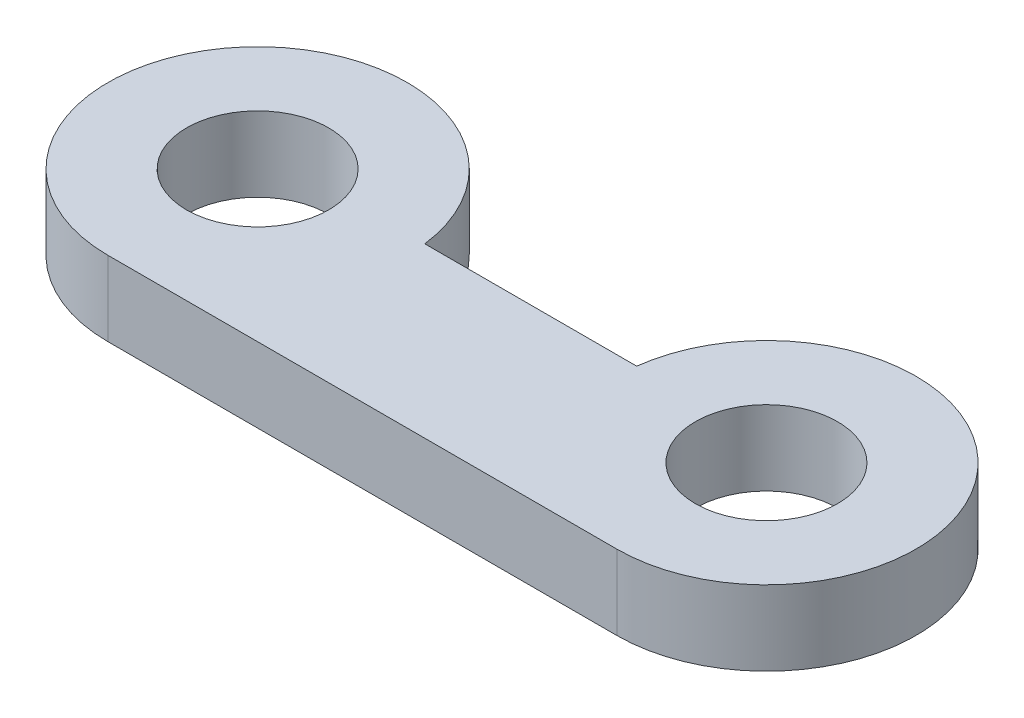
ISO-10303-21;
HEADER;
FILE_DESCRIPTION(('STEP AP214'),'2;1');
FILE_NAME('part.step','',(''),(''),'','','');
FILE_SCHEMA(('AUTOMOTIVE_DESIGN { 1 0 10303 214 1 1 1 1 }'));
ENDSEC;
DATA;
#1=APPLICATION_CONTEXT('core data for automotive mechanical design processes');
#2=APPLICATION_PROTOCOL_DEFINITION('international standard','automotive_design',2000,#1);
#3=PRODUCT_CONTEXT('',#1,'mechanical');
#4=PRODUCT('Part','Part','',(#3));
#5=PRODUCT_RELATED_PRODUCT_CATEGORY('part','',(#4));
#6=PRODUCT_DEFINITION_FORMATION('','',#4);
#7=PRODUCT_DEFINITION_CONTEXT('part definition',#1,'design');
#8=PRODUCT_DEFINITION('design','',#6,#7);
#9=PRODUCT_DEFINITION_SHAPE('','',#8);
#10=(LENGTH_UNIT() NAMED_UNIT(*) SI_UNIT(.MILLI.,.METRE.));
#11=(NAMED_UNIT(*) PLANE_ANGLE_UNIT() SI_UNIT($,.RADIAN.));
#12=(NAMED_UNIT(*) SI_UNIT($,.STERADIAN.) SOLID_ANGLE_UNIT());
#13=UNCERTAINTY_MEASURE_WITH_UNIT(LENGTH_MEASURE(1.E-05),#10,'distance_accuracy_value','');
#14=(GEOMETRIC_REPRESENTATION_CONTEXT(3) GLOBAL_UNCERTAINTY_ASSIGNED_CONTEXT((#13)) GLOBAL_UNIT_ASSIGNED_CONTEXT((#10,
#11,#12)) REPRESENTATION_CONTEXT('',''));
#15=CARTESIAN_POINT('',(0.,0.,0.));
#16=DIRECTION('',(0.,0.,1.));
#17=DIRECTION('',(1.,0.,0.));
#18=AXIS2_PLACEMENT_3D('',#15,#16,#17);
#19=CARTESIAN_POINT('',(-6.8,2.,-4.));
#20=DIRECTION('',(0.,-1.,0.));
#21=DIRECTION('',(0.,0.,-1.));
#22=AXIS2_PLACEMENT_3D('',#19,#20,#21);
#23=CYLINDRICAL_SURFACE('',#22,4.);
#24=CARTESIAN_POINT('',(-6.8,0.,-4.));
#25=DIRECTION('',(0.,1.,0.));
#26=DIRECTION('',(0.,0.,1.));
#27=AXIS2_PLACEMENT_3D('',#24,#25,#26);
#28=CIRCLE('',#27,4.);
#29=CARTESIAN_POINT('',(-2.83137303340311,0.,-4.5));
#30=VERTEX_POINT('',#29);
#31=CARTESIAN_POINT('',(-6.8,0.,0.));
#32=VERTEX_POINT('',#31);
#33=EDGE_CURVE('E123',#30,#32,#28,.T.);
#34=ORIENTED_EDGE('',*,*,#33,.T.);
#35=DIRECTION('',(0.,-1.,0.));
#36=VECTOR('',#35,1.);
#37=CARTESIAN_POINT('',(-6.8,2.,0.));
#38=LINE('',#37,#36);
#39=CARTESIAN_POINT('',(-6.8,2.,0.));
#40=VERTEX_POINT('',#39);
#41=EDGE_CURVE('E11',#40,#32,#38,.T.);
#42=ORIENTED_EDGE('',*,*,#41,.F.);
#43=CARTESIAN_POINT('',(-6.8,2.,-4.));
#44=DIRECTION('',(0.,1.,0.));
#45=DIRECTION('',(0.,0.,1.));
#46=AXIS2_PLACEMENT_3D('',#43,#44,#45);
#47=CIRCLE('',#46,4.);
#48=CARTESIAN_POINT('',(-2.83137303340311,2.,-4.5));
#49=VERTEX_POINT('',#48);
#50=EDGE_CURVE('E87',#49,#40,#47,.T.);
#51=ORIENTED_EDGE('',*,*,#50,.F.);
#52=DIRECTION('',(0.,-1.,0.));
#53=VECTOR('',#52,1.);
#54=CARTESIAN_POINT('',(-2.83137303340311,2.,-4.5));
#55=LINE('',#54,#53);
#56=EDGE_CURVE('E63',#49,#30,#55,.T.);
#57=ORIENTED_EDGE('',*,*,#56,.T.);
#58=EDGE_LOOP('',(#34,#42,#51,#57));
#59=FACE_BOUND('',#58,.T.);
#60=ADVANCED_FACE('F45',(#59),#23,.T.);
#61=CARTESIAN_POINT('',(0.,2.,0.));
#62=DIRECTION('',(0.,0.,1.));
#63=DIRECTION('',(1.,0.,0.));
#64=AXIS2_PLACEMENT_3D('',#61,#62,#63);
#65=PLANE('',#64);
#66=DIRECTION('',(-1.,0.,0.));
#67=VECTOR('',#66,1.);
#68=CARTESIAN_POINT('',(0.,0.,0.));
#69=LINE('',#68,#67);
#70=CARTESIAN_POINT('',(6.79999999999999,0.,0.));
#71=VERTEX_POINT('',#70);
#72=EDGE_CURVE('E96',#71,#32,#69,.T.);
#73=ORIENTED_EDGE('',*,*,#72,.F.);
#74=DIRECTION('',(0.,-1.,0.));
#75=VECTOR('',#74,1.);
#76=CARTESIAN_POINT('',(6.79999999999999,2.,0.));
#77=LINE('',#76,#75);
#78=CARTESIAN_POINT('',(6.79999999999999,2.,0.));
#79=VERTEX_POINT('',#78);
#80=EDGE_CURVE('E55',#79,#71,#77,.T.);
#81=ORIENTED_EDGE('',*,*,#80,.F.);
#82=DIRECTION('',(-1.,0.,0.));
#83=VECTOR('',#82,1.);
#84=CARTESIAN_POINT('',(0.,2.,0.));
#85=LINE('',#84,#83);
#86=EDGE_CURVE('E94',#79,#40,#85,.T.);
#87=ORIENTED_EDGE('',*,*,#86,.T.);
#88=ORIENTED_EDGE('',*,*,#41,.T.);
#89=EDGE_LOOP('',(#73,#81,#87,#88));
#90=FACE_BOUND('',#89,.T.);
#91=ADVANCED_FACE('F93',(#90),#65,.T.);
#92=CARTESIAN_POINT('',(6.79999999999997,2.,-4.00000000000006));
#93=DIRECTION('',(0.,-1.,0.));
#94=DIRECTION('',(0.,0.,-1.));
#95=AXIS2_PLACEMENT_3D('',#92,#93,#94);
#96=CYLINDRICAL_SURFACE('',#95,3.99999999999999);
#97=CARTESIAN_POINT('',(6.79999999999997,0.,-4.00000000000006));
#98=DIRECTION('',(0.,1.,0.));
#99=DIRECTION('',(0.,0.,1.));
#100=AXIS2_PLACEMENT_3D('',#97,#98,#99);
#101=CIRCLE('',#100,3.99999999999999);
#102=CARTESIAN_POINT('',(2.83137303340308,0.,-4.5));
#103=VERTEX_POINT('',#102);
#104=EDGE_CURVE('E128',#103,#71,#101,.F.);
#105=ORIENTED_EDGE('',*,*,#104,.F.);
#106=DIRECTION('',(0.,-1.,0.));
#107=VECTOR('',#106,1.);
#108=CARTESIAN_POINT('',(2.83137303340308,2.,-4.5));
#109=LINE('',#108,#107);
#110=CARTESIAN_POINT('',(2.83137303340308,2.,-4.5));
#111=VERTEX_POINT('',#110);
#112=EDGE_CURVE('E76',#111,#103,#109,.T.);
#113=ORIENTED_EDGE('',*,*,#112,.F.);
#114=CARTESIAN_POINT('',(6.79999999999997,2.,-4.00000000000006));
#115=DIRECTION('',(0.,1.,0.));
#116=DIRECTION('',(0.,0.,1.));
#117=AXIS2_PLACEMENT_3D('',#114,#115,#116);
#118=CIRCLE('',#117,3.99999999999999);
#119=EDGE_CURVE('E104',#111,#79,#118,.F.);
#120=ORIENTED_EDGE('',*,*,#119,.T.);
#121=ORIENTED_EDGE('',*,*,#80,.T.);
#122=EDGE_LOOP('',(#105,#113,#120,#121));
#123=FACE_BOUND('',#122,.T.);
#124=ADVANCED_FACE('F107',(#123),#96,.T.);
#125=CARTESIAN_POINT('',(0.,2.,-4.5));
#126=DIRECTION('',(0.,0.,-1.));
#127=DIRECTION('',(-1.,0.,0.));
#128=AXIS2_PLACEMENT_3D('',#125,#126,#127);
#129=PLANE('',#128);
#130=DIRECTION('',(1.,0.,0.));
#131=VECTOR('',#130,1.);
#132=CARTESIAN_POINT('',(0.,0.,-4.5));
#133=LINE('',#132,#131);
#134=EDGE_CURVE('E131',#30,#103,#133,.T.);
#135=ORIENTED_EDGE('',*,*,#134,.F.);
#136=ORIENTED_EDGE('',*,*,#56,.F.);
#137=DIRECTION('',(1.,0.,0.));
#138=VECTOR('',#137,1.);
#139=CARTESIAN_POINT('',(0.,2.,-4.5));
#140=LINE('',#139,#138);
#141=EDGE_CURVE('E109',#49,#111,#140,.T.);
#142=ORIENTED_EDGE('',*,*,#141,.T.);
#143=ORIENTED_EDGE('',*,*,#112,.T.);
#144=EDGE_LOOP('',(#135,#136,#142,#143));
#145=FACE_BOUND('',#144,.T.);
#146=ADVANCED_FACE('F173',(#145),#129,.T.);
#147=CARTESIAN_POINT('',(-6.8,2.,-4.));
#148=DIRECTION('',(0.,-1.,0.));
#149=DIRECTION('',(0.,0.,-1.));
#150=AXIS2_PLACEMENT_3D('',#147,#148,#149);
#151=CYLINDRICAL_SURFACE('',#150,1.9);
#152=CARTESIAN_POINT('',(-6.8,2.,-4.));
#153=DIRECTION('',(0.,1.,0.));
#154=DIRECTION('',(0.,0.,1.));
#155=AXIS2_PLACEMENT_3D('',#152,#153,#154);
#156=CIRCLE('',#155,1.9);
#157=CARTESIAN_POINT('',(-6.8,2.,-2.1));
#158=VERTEX_POINT('',#157);
#159=EDGE_CURVE('E139',#158,#158,#156,.T.);
#160=ORIENTED_EDGE('',*,*,#159,.T.);
#161=EDGE_LOOP('',(#160));
#162=FACE_BOUND('',#161,.T.);
#163=CARTESIAN_POINT('',(-6.8,0.,-4.));
#164=DIRECTION('',(0.,1.,0.));
#165=DIRECTION('',(0.,0.,1.));
#166=AXIS2_PLACEMENT_3D('',#163,#164,#165);
#167=CIRCLE('',#166,1.9);
#168=CARTESIAN_POINT('',(-6.8,0.,-2.1));
#169=VERTEX_POINT('',#168);
#170=EDGE_CURVE('E119',#169,#169,#167,.T.);
#171=ORIENTED_EDGE('',*,*,#170,.F.);
#172=EDGE_LOOP('',(#171));
#173=FACE_BOUND('',#172,.T.);
#174=ADVANCED_FACE('F47',(#162,#173),#151,.F.);
#175=CARTESIAN_POINT('',(6.79999999999997,2.,-4.00000000000006));
#176=DIRECTION('',(0.,-1.,0.));
#177=DIRECTION('',(0.,0.,-1.));
#178=AXIS2_PLACEMENT_3D('',#175,#176,#177);
#179=CYLINDRICAL_SURFACE('',#178,1.9);
#180=CARTESIAN_POINT('',(6.79999999999997,2.,-4.00000000000006));
#181=DIRECTION('',(0.,1.,0.));
#182=DIRECTION('',(0.,0.,1.));
#183=AXIS2_PLACEMENT_3D('',#180,#181,#182);
#184=CIRCLE('',#183,1.9);
#185=CARTESIAN_POINT('',(6.79999999999997,2.,-2.10000000000005));
#186=VERTEX_POINT('',#185);
#187=EDGE_CURVE('E112',#186,#186,#184,.F.);
#188=ORIENTED_EDGE('',*,*,#187,.F.);
#189=EDGE_LOOP('',(#188));
#190=FACE_BOUND('',#189,.T.);
#191=CARTESIAN_POINT('',(6.79999999999997,0.,-4.00000000000006));
#192=DIRECTION('',(0.,1.,0.));
#193=DIRECTION('',(0.,0.,1.));
#194=AXIS2_PLACEMENT_3D('',#191,#192,#193);
#195=CIRCLE('',#194,1.9);
#196=CARTESIAN_POINT('',(6.79999999999997,0.,-2.10000000000005));
#197=VERTEX_POINT('',#196);
#198=EDGE_CURVE('E135',#197,#197,#195,.F.);
#199=ORIENTED_EDGE('',*,*,#198,.T.);
#200=EDGE_LOOP('',(#199));
#201=FACE_BOUND('',#200,.T.);
#202=ADVANCED_FACE('F155',(#190,#201),#179,.F.);
#203=CARTESIAN_POINT('',(0.,2.,0.));
#204=DIRECTION('',(0.,1.,0.));
#205=DIRECTION('',(0.,0.,1.));
#206=AXIS2_PLACEMENT_3D('',#203,#204,#205);
#207=PLANE('',#206);
#208=ORIENTED_EDGE('',*,*,#159,.F.);
#209=EDGE_LOOP('',(#208));
#210=FACE_BOUND('',#209,.T.);
#211=ORIENTED_EDGE('',*,*,#50,.T.);
#212=ORIENTED_EDGE('',*,*,#86,.F.);
#213=ORIENTED_EDGE('',*,*,#119,.F.);
#214=ORIENTED_EDGE('',*,*,#141,.F.);
#215=EDGE_LOOP('',(#211,#212,#213,#214));
#216=FACE_BOUND('',#215,.T.);
#217=ORIENTED_EDGE('',*,*,#187,.T.);
#218=EDGE_LOOP('',(#217));
#219=FACE_BOUND('',#218,.T.);
#220=ADVANCED_FACE('F102',(#210,#216,#219),#207,.T.);
#221=CARTESIAN_POINT('',(0.,0.,0.));
#222=DIRECTION('',(0.,1.,0.));
#223=DIRECTION('',(0.,0.,1.));
#224=AXIS2_PLACEMENT_3D('',#221,#222,#223);
#225=PLANE('',#224);
#226=ORIENTED_EDGE('',*,*,#170,.T.);
#227=EDGE_LOOP('',(#226));
#228=FACE_BOUND('',#227,.T.);
#229=ORIENTED_EDGE('',*,*,#33,.F.);
#230=ORIENTED_EDGE('',*,*,#134,.T.);
#231=ORIENTED_EDGE('',*,*,#104,.T.);
#232=ORIENTED_EDGE('',*,*,#72,.T.);
#233=EDGE_LOOP('',(#229,#230,#231,#232));
#234=FACE_BOUND('',#233,.T.);
#235=ORIENTED_EDGE('',*,*,#198,.F.);
#236=EDGE_LOOP('',(#235));
#237=FACE_BOUND('',#236,.T.);
#238=ADVANCED_FACE('F154',(#228,#234,#237),#225,.F.);
#239=CLOSED_SHELL('',(#60,#91,#124,#146,#174,#202,#220,#238));
#240=MANIFOLD_SOLID_BREP('B2',#239);
#241=ADVANCED_BREP_SHAPE_REPRESENTATION('',(#18,#240),#14);
#242=SHAPE_DEFINITION_REPRESENTATION(#9,#241);
ENDSEC;
END-ISO-10303-21;
